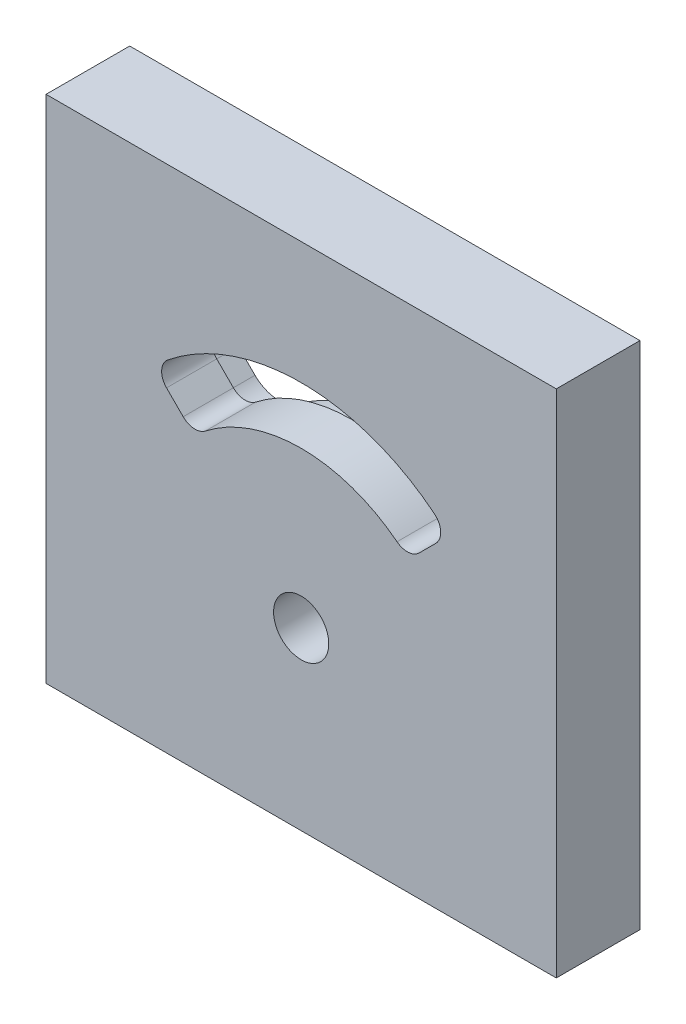
ISO-10303-21;
HEADER;
FILE_DESCRIPTION(('STEP AP214'),'2;1');
FILE_NAME('part.step','',(''),(''),'','','');
FILE_SCHEMA(('AUTOMOTIVE_DESIGN { 1 0 10303 214 1 1 1 1 }'));
ENDSEC;
DATA;
#1=APPLICATION_CONTEXT('core data for automotive mechanical design processes');
#2=APPLICATION_PROTOCOL_DEFINITION('international standard','automotive_design',2000,#1);
#3=PRODUCT_CONTEXT('',#1,'mechanical');
#4=PRODUCT('Part','Part','',(#3));
#5=PRODUCT_RELATED_PRODUCT_CATEGORY('part','',(#4));
#6=PRODUCT_DEFINITION_FORMATION('','',#4);
#7=PRODUCT_DEFINITION_CONTEXT('part definition',#1,'design');
#8=PRODUCT_DEFINITION('design','',#6,#7);
#9=PRODUCT_DEFINITION_SHAPE('','',#8);
#10=(LENGTH_UNIT() NAMED_UNIT(*) SI_UNIT(.MILLI.,.METRE.));
#11=(NAMED_UNIT(*) PLANE_ANGLE_UNIT() SI_UNIT($,.RADIAN.));
#12=(NAMED_UNIT(*) SI_UNIT($,.STERADIAN.) SOLID_ANGLE_UNIT());
#13=UNCERTAINTY_MEASURE_WITH_UNIT(LENGTH_MEASURE(1.E-05),#10,'distance_accuracy_value','');
#14=(GEOMETRIC_REPRESENTATION_CONTEXT(3) GLOBAL_UNCERTAINTY_ASSIGNED_CONTEXT((#13)) GLOBAL_UNIT_ASSIGNED_CONTEXT((#10,
#11,#12)) REPRESENTATION_CONTEXT('',''));
#15=CARTESIAN_POINT('',(0.,0.,0.));
#16=DIRECTION('',(0.,0.,1.));
#17=DIRECTION('',(1.,0.,0.));
#18=AXIS2_PLACEMENT_3D('',#15,#16,#17);
#19=CARTESIAN_POINT('',(0.,-4.75,-5.));
#20=DIRECTION('',(0.,0.,1.));
#21=DIRECTION('',(1.,0.,0.));
#22=AXIS2_PLACEMENT_3D('',#19,#20,#21);
#23=CYLINDRICAL_SURFACE('',#22,12.7);
#24=DIRECTION('',(0.,0.,1.));
#25=VECTOR('',#24,1.);
#26=CARTESIAN_POINT('',(-7.9700377500765,5.13779541972605,-5.));
#27=LINE('',#26,#25);
#28=CARTESIAN_POINT('',(-7.97003775007651,5.13779541972605,0.));
#29=VERTEX_POINT('',#28);
#30=CARTESIAN_POINT('',(-7.97003775007651,5.13779541972605,-3.));
#31=VERTEX_POINT('',#30);
#32=EDGE_CURVE('E11',#29,#31,#27,.F.);
#33=ORIENTED_EDGE('',*,*,#32,.T.);
#34=CARTESIAN_POINT('',(0.,-4.75,-3.));
#35=DIRECTION('',(0.,0.,-1.));
#36=DIRECTION('',(-1.,0.,0.));
#37=AXIS2_PLACEMENT_3D('',#34,#35,#36);
#38=CIRCLE('',#37,12.7);
#39=CARTESIAN_POINT('',(7.9700377500765,5.13779541972605,-3.));
#40=VERTEX_POINT('',#39);
#41=EDGE_CURVE('E24',#31,#40,#38,.T.);
#42=ORIENTED_EDGE('',*,*,#41,.T.);
#43=DIRECTION('',(0.,0.,1.));
#44=VECTOR('',#43,1.);
#45=CARTESIAN_POINT('',(7.97003775007651,5.13779541972605,-5.));
#46=LINE('',#45,#44);
#47=CARTESIAN_POINT('',(7.9700377500765,5.13779541972605,0.));
#48=VERTEX_POINT('',#47);
#49=EDGE_CURVE('E434',#40,#48,#46,.T.);
#50=ORIENTED_EDGE('',*,*,#49,.T.);
#51=CARTESIAN_POINT('',(0.,-4.75,0.));
#52=DIRECTION('',(0.,0.,-1.));
#53=DIRECTION('',(-1.,0.,0.));
#54=AXIS2_PLACEMENT_3D('',#51,#52,#53);
#55=CIRCLE('',#54,12.7);
#56=EDGE_CURVE('E431',#29,#48,#55,.T.);
#57=ORIENTED_EDGE('',*,*,#56,.F.);
#58=EDGE_LOOP('',(#33,#42,#50,#57));
#59=FACE_BOUND('',#58,.T.);
#60=ADVANCED_FACE('F17',(#59),#23,.F.);
#61=CARTESIAN_POINT('',(-8.18900691705113,3.79154648341029,-5.));
#62=DIRECTION('',(-0.707106781186548,-0.707106781186547,0.));
#63=DIRECTION('',(0.707106781186547,-0.707106781186548,0.));
#64=AXIS2_PLACEMENT_3D('',#61,#62,#63);
#65=PLANE('',#64);
#66=DIRECTION('',(0.707106781186547,-0.707106781186548,0.));
#67=VECTOR('',#66,1.);
#68=CARTESIAN_POINT('',(-8.18900691705113,3.79154648341029,-3.));
#69=LINE('',#68,#67);
#70=CARTESIAN_POINT('',(-8.04958250369797,3.65212207005713,-3.));
#71=VERTEX_POINT('',#70);
#72=CARTESIAN_POINT('',(-7.05315936755762,2.65569893391677,-3.));
#73=VERTEX_POINT('',#72);
#74=EDGE_CURVE('E428',#71,#73,#69,.T.);
#75=ORIENTED_EDGE('',*,*,#74,.F.);
#76=DIRECTION('',(0.,0.,1.));
#77=VECTOR('',#76,1.);
#78=CARTESIAN_POINT('',(-8.04958250369797,3.65212207005713,-5.));
#79=LINE('',#78,#77);
#80=CARTESIAN_POINT('',(-8.04958250369797,3.65212207005713,0.));
#81=VERTEX_POINT('',#80);
#82=EDGE_CURVE('E426',#71,#81,#79,.T.);
#83=ORIENTED_EDGE('',*,*,#82,.T.);
#84=DIRECTION('',(0.707106781186547,-0.707106781186548,0.));
#85=VECTOR('',#84,1.);
#86=CARTESIAN_POINT('',(-8.18900691705113,3.79154648341029,0.));
#87=LINE('',#86,#85);
#88=CARTESIAN_POINT('',(-7.05315936755762,2.65569893391677,0.));
#89=VERTEX_POINT('',#88);
#90=EDGE_CURVE('E424',#81,#89,#87,.T.);
#91=ORIENTED_EDGE('',*,*,#90,.T.);
#92=DIRECTION('',(0.,0.,-1.));
#93=VECTOR('',#92,1.);
#94=CARTESIAN_POINT('',(-7.05315936755762,2.65569893391677,-5.));
#95=LINE('',#94,#93);
#96=EDGE_CURVE('E422',#89,#73,#95,.T.);
#97=ORIENTED_EDGE('',*,*,#96,.T.);
#98=EDGE_LOOP('',(#75,#83,#91,#97));
#99=FACE_BOUND('',#98,.T.);
#100=ADVANCED_FACE('F467',(#99),#65,.F.);
#101=CARTESIAN_POINT('',(0.,-4.75,-5.));
#102=DIRECTION('',(0.,0.,1.));
#103=DIRECTION('',(1.,0.,0.));
#104=AXIS2_PLACEMENT_3D('',#101,#102,#103);
#105=CYLINDRICAL_SURFACE('',#104,9.3);
#106=CARTESIAN_POINT('',(0.,-4.75,-3.));
#107=DIRECTION('',(0.,0.,-1.));
#108=DIRECTION('',(-1.,0.,0.));
#109=AXIS2_PLACEMENT_3D('',#106,#107,#108);
#110=CIRCLE('',#109,9.3);
#111=CARTESIAN_POINT('',(-5.72993097604378,2.57515467480203,-3.));
#112=VERTEX_POINT('',#111);
#113=CARTESIAN_POINT('',(5.72993097604378,2.57515467480203,-3.));
#114=VERTEX_POINT('',#113);
#115=EDGE_CURVE('E419',#112,#114,#110,.T.);
#116=ORIENTED_EDGE('',*,*,#115,.F.);
#117=DIRECTION('',(0.,0.,1.));
#118=VECTOR('',#117,1.);
#119=CARTESIAN_POINT('',(-5.72993097604378,2.57515467480203,-5.));
#120=LINE('',#119,#118);
#121=CARTESIAN_POINT('',(-5.72993097604378,2.57515467480203,0.));
#122=VERTEX_POINT('',#121);
#123=EDGE_CURVE('E417',#112,#122,#120,.T.);
#124=ORIENTED_EDGE('',*,*,#123,.T.);
#125=CARTESIAN_POINT('',(0.,-4.75,0.));
#126=DIRECTION('',(0.,0.,-1.));
#127=DIRECTION('',(-1.,0.,0.));
#128=AXIS2_PLACEMENT_3D('',#125,#126,#127);
#129=CIRCLE('',#128,9.3);
#130=CARTESIAN_POINT('',(5.72993097604378,2.57515467480203,0.));
#131=VERTEX_POINT('',#130);
#132=EDGE_CURVE('E415',#122,#131,#129,.T.);
#133=ORIENTED_EDGE('',*,*,#132,.T.);
#134=DIRECTION('',(0.,0.,1.));
#135=VECTOR('',#134,1.);
#136=CARTESIAN_POINT('',(5.72993097604378,2.57515467480203,-5.));
#137=LINE('',#136,#135);
#138=EDGE_CURVE('E413',#131,#114,#137,.F.);
#139=ORIENTED_EDGE('',*,*,#138,.T.);
#140=EDGE_LOOP('',(#116,#124,#133,#139));
#141=FACE_BOUND('',#140,.T.);
#142=ADVANCED_FACE('F460',(#141),#105,.T.);
#143=CARTESIAN_POINT('',(8.18900691705112,3.79154648341028,-5.));
#144=DIRECTION('',(-0.707106781186547,0.707106781186548,0.));
#145=DIRECTION('',(-0.707106781186548,-0.707106781186547,0.));
#146=AXIS2_PLACEMENT_3D('',#143,#144,#145);
#147=PLANE('',#146);
#148=DIRECTION('',(0.,0.,-1.));
#149=VECTOR('',#148,1.);
#150=CARTESIAN_POINT('',(8.04958250369798,3.65212207005714,-5.));
#151=LINE('',#150,#149);
#152=CARTESIAN_POINT('',(8.04958250369798,3.65212207005714,0.));
#153=VERTEX_POINT('',#152);
#154=CARTESIAN_POINT('',(8.04958250369798,3.65212207005714,-3.));
#155=VERTEX_POINT('',#154);
#156=EDGE_CURVE('E411',#153,#155,#151,.T.);
#157=ORIENTED_EDGE('',*,*,#156,.T.);
#158=DIRECTION('',(-0.707106781186548,-0.707106781186547,0.));
#159=VECTOR('',#158,1.);
#160=CARTESIAN_POINT('',(8.18900691705112,3.79154648341028,-3.));
#161=LINE('',#160,#159);
#162=CARTESIAN_POINT('',(7.05315936755761,2.65569893391677,-3.));
#163=VERTEX_POINT('',#162);
#164=EDGE_CURVE('E409',#155,#163,#161,.T.);
#165=ORIENTED_EDGE('',*,*,#164,.T.);
#166=DIRECTION('',(0.,0.,1.));
#167=VECTOR('',#166,1.);
#168=CARTESIAN_POINT('',(7.05315936755761,2.65569893391677,-5.));
#169=LINE('',#168,#167);
#170=CARTESIAN_POINT('',(7.05315936755761,2.65569893391677,0.));
#171=VERTEX_POINT('',#170);
#172=EDGE_CURVE('E407',#163,#171,#169,.T.);
#173=ORIENTED_EDGE('',*,*,#172,.T.);
#174=DIRECTION('',(-0.707106781186548,-0.707106781186547,0.));
#175=VECTOR('',#174,1.);
#176=CARTESIAN_POINT('',(8.18900691705112,3.79154648341028,0.));
#177=LINE('',#176,#175);
#178=EDGE_CURVE('E404',#153,#171,#177,.T.);
#179=ORIENTED_EDGE('',*,*,#178,.F.);
#180=EDGE_LOOP('',(#157,#165,#173,#179));
#181=FACE_BOUND('',#180,.T.);
#182=ADVANCED_FACE('F452',(#181),#147,.T.);
#183=CARTESIAN_POINT('',(0.,-1.09875,-5.));
#184=DIRECTION('',(0.,0.,-1.));
#185=DIRECTION('',(1.,0.,0.));
#186=AXIS2_PLACEMENT_3D('',#183,#184,#185);
#187=PLANE('',#186);
#188=CARTESIAN_POINT('',(0.,-4.75,-5.));
#189=DIRECTION('',(0.,0.,-1.));
#190=DIRECTION('',(-1.,0.,0.));
#191=AXIS2_PLACEMENT_3D('',#188,#189,#190);
#192=CIRCLE('',#191,1.65);
#193=CARTESIAN_POINT('',(-1.65,-4.75,-5.));
#194=VERTEX_POINT('',#193);
#195=EDGE_CURVE('E399',#194,#194,#192,.T.);
#196=ORIENTED_EDGE('',*,*,#195,.F.);
#197=EDGE_LOOP('',(#196));
#198=FACE_BOUND('',#197,.T.);
#199=DIRECTION('',(0.,1.,0.));
#200=VECTOR('',#199,1.);
#201=CARTESIAN_POINT('',(15.25,-15.25,-5.));
#202=LINE('',#201,#200);
#203=CARTESIAN_POINT('',(15.25,-15.25,-5.));
#204=VERTEX_POINT('',#203);
#205=CARTESIAN_POINT('',(15.25,15.25,-5.));
#206=VERTEX_POINT('',#205);
#207=EDGE_CURVE('E395',#204,#206,#202,.T.);
#208=ORIENTED_EDGE('',*,*,#207,.F.);
#209=DIRECTION('',(1.,0.,0.));
#210=VECTOR('',#209,1.);
#211=CARTESIAN_POINT('',(-15.25,-15.25,-5.));
#212=LINE('',#211,#210);
#213=CARTESIAN_POINT('',(-15.25,-15.25,-5.));
#214=VERTEX_POINT('',#213);
#215=EDGE_CURVE('E391',#214,#204,#212,.T.);
#216=ORIENTED_EDGE('',*,*,#215,.F.);
#217=DIRECTION('',(0.,-1.,0.));
#218=VECTOR('',#217,1.);
#219=CARTESIAN_POINT('',(-15.25,15.25,-5.));
#220=LINE('',#219,#218);
#221=CARTESIAN_POINT('',(-15.25,15.25,-5.));
#222=VERTEX_POINT('',#221);
#223=EDGE_CURVE('E387',#222,#214,#220,.T.);
#224=ORIENTED_EDGE('',*,*,#223,.F.);
#225=DIRECTION('',(-1.,0.,0.));
#226=VECTOR('',#225,1.);
#227=CARTESIAN_POINT('',(15.25,15.25,-5.));
#228=LINE('',#227,#226);
#229=EDGE_CURVE('E385',#206,#222,#228,.T.);
#230=ORIENTED_EDGE('',*,*,#229,.F.);
#231=EDGE_LOOP('',(#208,#216,#224,#230));
#232=FACE_BOUND('',#231,.T.);
#233=CARTESIAN_POINT('',(0.,-4.75,-5.));
#234=DIRECTION('',(0.,0.,-1.));
#235=DIRECTION('',(-1.,0.,0.));
#236=AXIS2_PLACEMENT_3D('',#233,#234,#235);
#237=CIRCLE('',#236,8.3);
#238=CARTESIAN_POINT('',(-5.11380936571649,1.78750363450073,-5.));
#239=VERTEX_POINT('',#238);
#240=CARTESIAN_POINT('',(5.11380936571649,1.78750363450073,-5.));
#241=VERTEX_POINT('',#240);
#242=EDGE_CURVE('E383',#239,#241,#237,.T.);
#243=ORIENTED_EDGE('',*,*,#242,.T.);
#244=CARTESIAN_POINT('',(6.34605258637106,3.36280571510332,-5.));
#245=DIRECTION('',(0.,0.,1.));
#246=DIRECTION('',(-1.,0.,0.));
#247=AXIS2_PLACEMENT_3D('',#244,#245,#246);
#248=CIRCLE('',#247,2.);
#249=CARTESIAN_POINT('',(7.76026614874416,1.94859215273023,-5.));
#250=VERTEX_POINT('',#249);
#251=EDGE_CURVE('E381',#241,#250,#248,.T.);
#252=ORIENTED_EDGE('',*,*,#251,.T.);
#253=DIRECTION('',(-0.707106781186548,-0.707106781186548,0.));
#254=VECTOR('',#253,1.);
#255=CARTESIAN_POINT('',(8.25847771681434,2.44680372080041,-5.));
#256=LINE('',#255,#254);
#257=CARTESIAN_POINT('',(8.75668928488452,2.94501528887059,-5.));
#258=VERTEX_POINT('',#257);
#259=EDGE_CURVE('E379',#258,#250,#256,.T.);
#260=ORIENTED_EDGE('',*,*,#259,.F.);
#261=CARTESIAN_POINT('',(7.34247572251143,4.35922885124369,-5.));
#262=DIRECTION('',(0.,0.,1.));
#263=DIRECTION('',(-1.,0.,0.));
#264=AXIS2_PLACEMENT_3D('',#261,#262,#263);
#265=CIRCLE('',#264,2.);
#266=CARTESIAN_POINT('',(8.59759977764159,5.91636198820842,-5.));
#267=VERTEX_POINT('',#266);
#268=EDGE_CURVE('E157',#258,#267,#265,.T.);
#269=ORIENTED_EDGE('',*,*,#268,.T.);
#270=CARTESIAN_POINT('',(0.,-4.75,-5.));
#271=DIRECTION('',(0.,0.,-1.));
#272=DIRECTION('',(-1.,0.,0.));
#273=AXIS2_PLACEMENT_3D('',#270,#271,#272);
#274=CIRCLE('',#273,13.7);
#275=CARTESIAN_POINT('',(-8.59759977764158,5.91636198820842,-5.));
#276=VERTEX_POINT('',#275);
#277=EDGE_CURVE('E375',#276,#267,#274,.T.);
#278=ORIENTED_EDGE('',*,*,#277,.F.);
#279=CARTESIAN_POINT('',(-7.34247572251143,4.35922885124368,-5.));
#280=DIRECTION('',(0.,0.,1.));
#281=DIRECTION('',(-1.,0.,0.));
#282=AXIS2_PLACEMENT_3D('',#279,#280,#281);
#283=CIRCLE('',#282,2.);
#284=CARTESIAN_POINT('',(-8.75668928488452,2.94501528887058,-5.));
#285=VERTEX_POINT('',#284);
#286=EDGE_CURVE('E373',#276,#285,#283,.T.);
#287=ORIENTED_EDGE('',*,*,#286,.T.);
#288=DIRECTION('',(0.707106781186547,-0.707106781186548,0.));
#289=VECTOR('',#288,1.);
#290=CARTESIAN_POINT('',(-8.25847771681434,2.44680372080041,-5.));
#291=LINE('',#290,#289);
#292=CARTESIAN_POINT('',(-7.76026614874417,1.94859215273023,-5.));
#293=VERTEX_POINT('',#292);
#294=EDGE_CURVE('E371',#285,#293,#291,.T.);
#295=ORIENTED_EDGE('',*,*,#294,.T.);
#296=CARTESIAN_POINT('',(-6.34605258637107,3.36280571510332,-5.));
#297=DIRECTION('',(0.,0.,1.));
#298=DIRECTION('',(-1.,0.,0.));
#299=AXIS2_PLACEMENT_3D('',#296,#297,#298);
#300=CIRCLE('',#299,2.);
#301=EDGE_CURVE('E369',#293,#239,#300,.T.);
#302=ORIENTED_EDGE('',*,*,#301,.T.);
#303=EDGE_LOOP('',(#243,#252,#260,#269,#278,#287,#295,#302));
#304=FACE_BOUND('',#303,.T.);
#305=ADVANCED_FACE('F479',(#198,#232,#304),#187,.T.);
#306=CARTESIAN_POINT('',(-7.34247572251142,4.35922885124368,-5.));
#307=DIRECTION('',(0.,0.,1.));
#308=DIRECTION('',(1.,0.,0.));
#309=AXIS2_PLACEMENT_3D('',#306,#307,#308);
#310=CYLINDRICAL_SURFACE('',#309,1.);
#311=CARTESIAN_POINT('',(-7.34247572251142,4.35922885124368,-3.));
#312=DIRECTION('',(0.,0.,-1.));
#313=DIRECTION('',(-1.,0.,0.));
#314=AXIS2_PLACEMENT_3D('',#311,#312,#313);
#315=CIRCLE('',#314,1.);
#316=EDGE_CURVE('E366',#31,#71,#315,.F.);
#317=ORIENTED_EDGE('',*,*,#316,.F.);
#318=ORIENTED_EDGE('',*,*,#32,.F.);
#319=CARTESIAN_POINT('',(-7.34247572251142,4.35922885124368,0.));
#320=DIRECTION('',(0.,0.,-1.));
#321=DIRECTION('',(-1.,0.,0.));
#322=AXIS2_PLACEMENT_3D('',#319,#320,#321);
#323=CIRCLE('',#322,1.);
#324=EDGE_CURVE('E363',#81,#29,#323,.T.);
#325=ORIENTED_EDGE('',*,*,#324,.F.);
#326=ORIENTED_EDGE('',*,*,#82,.F.);
#327=EDGE_LOOP('',(#317,#318,#325,#326));
#328=FACE_BOUND('',#327,.T.);
#329=ADVANCED_FACE('F447',(#328),#310,.F.);
#330=CARTESIAN_POINT('',(7.34247572251143,4.35922885124368,-5.));
#331=DIRECTION('',(0.,0.,1.));
#332=DIRECTION('',(1.,0.,0.));
#333=AXIS2_PLACEMENT_3D('',#330,#331,#332);
#334=CYLINDRICAL_SURFACE('',#333,1.);
#335=CARTESIAN_POINT('',(7.34247572251143,4.35922885124368,-3.));
#336=DIRECTION('',(0.,0.,-1.));
#337=DIRECTION('',(-1.,0.,0.));
#338=AXIS2_PLACEMENT_3D('',#335,#336,#337);
#339=CIRCLE('',#338,1.);
#340=EDGE_CURVE('E360',#155,#40,#339,.F.);
#341=ORIENTED_EDGE('',*,*,#340,.F.);
#342=ORIENTED_EDGE('',*,*,#156,.F.);
#343=CARTESIAN_POINT('',(7.34247572251143,4.35922885124368,0.));
#344=DIRECTION('',(0.,0.,-1.));
#345=DIRECTION('',(-1.,0.,0.));
#346=AXIS2_PLACEMENT_3D('',#343,#344,#345);
#347=CIRCLE('',#346,1.);
#348=EDGE_CURVE('E357',#48,#153,#347,.T.);
#349=ORIENTED_EDGE('',*,*,#348,.F.);
#350=ORIENTED_EDGE('',*,*,#49,.F.);
#351=EDGE_LOOP('',(#341,#342,#349,#350));
#352=FACE_BOUND('',#351,.T.);
#353=ADVANCED_FACE('F439',(#352),#334,.F.);
#354=CARTESIAN_POINT('',(6.34605258637106,3.36280571510332,-5.));
#355=DIRECTION('',(0.,0.,1.));
#356=DIRECTION('',(1.,0.,0.));
#357=AXIS2_PLACEMENT_3D('',#354,#355,#356);
#358=CYLINDRICAL_SURFACE('',#357,1.);
#359=CARTESIAN_POINT('',(6.34605258637106,3.36280571510332,-3.));
#360=DIRECTION('',(0.,0.,-1.));
#361=DIRECTION('',(-1.,0.,0.));
#362=AXIS2_PLACEMENT_3D('',#359,#360,#361);
#363=CIRCLE('',#362,1.);
#364=EDGE_CURVE('E354',#114,#163,#363,.F.);
#365=ORIENTED_EDGE('',*,*,#364,.F.);
#366=ORIENTED_EDGE('',*,*,#138,.F.);
#367=CARTESIAN_POINT('',(6.34605258637106,3.36280571510332,0.));
#368=DIRECTION('',(0.,0.,-1.));
#369=DIRECTION('',(-1.,0.,0.));
#370=AXIS2_PLACEMENT_3D('',#367,#368,#369);
#371=CIRCLE('',#370,1.);
#372=EDGE_CURVE('E351',#171,#131,#371,.T.);
#373=ORIENTED_EDGE('',*,*,#372,.F.);
#374=ORIENTED_EDGE('',*,*,#172,.F.);
#375=EDGE_LOOP('',(#365,#366,#373,#374));
#376=FACE_BOUND('',#375,.T.);
#377=ADVANCED_FACE('F455',(#376),#358,.F.);
#378=CARTESIAN_POINT('',(-6.34605258637107,3.36280571510332,-5.));
#379=DIRECTION('',(0.,0.,1.));
#380=DIRECTION('',(1.,0.,0.));
#381=AXIS2_PLACEMENT_3D('',#378,#379,#380);
#382=CYLINDRICAL_SURFACE('',#381,1.);
#383=CARTESIAN_POINT('',(-6.34605258637107,3.36280571510332,-3.));
#384=DIRECTION('',(0.,0.,-1.));
#385=DIRECTION('',(-1.,0.,0.));
#386=AXIS2_PLACEMENT_3D('',#383,#384,#385);
#387=CIRCLE('',#386,1.);
#388=EDGE_CURVE('E348',#73,#112,#387,.F.);
#389=ORIENTED_EDGE('',*,*,#388,.F.);
#390=ORIENTED_EDGE('',*,*,#96,.F.);
#391=CARTESIAN_POINT('',(-6.34605258637107,3.36280571510332,0.));
#392=DIRECTION('',(0.,0.,-1.));
#393=DIRECTION('',(-1.,0.,0.));
#394=AXIS2_PLACEMENT_3D('',#391,#392,#393);
#395=CIRCLE('',#394,1.);
#396=EDGE_CURVE('E343',#122,#89,#395,.T.);
#397=ORIENTED_EDGE('',*,*,#396,.F.);
#398=ORIENTED_EDGE('',*,*,#123,.F.);
#399=EDGE_LOOP('',(#389,#390,#397,#398));
#400=FACE_BOUND('',#399,.T.);
#401=ADVANCED_FACE('F465',(#400),#382,.F.);
#402=CARTESIAN_POINT('',(15.25,-15.25,-5.));
#403=DIRECTION('',(1.,0.,0.));
#404=DIRECTION('',(0.,1.,0.));
#405=AXIS2_PLACEMENT_3D('',#402,#403,#404);
#406=PLANE('',#405);
#407=DIRECTION('',(0.,1.,0.));
#408=VECTOR('',#407,1.);
#409=CARTESIAN_POINT('',(15.25,-15.25,0.));
#410=LINE('',#409,#408);
#411=CARTESIAN_POINT('',(15.25,-15.25,0.));
#412=VERTEX_POINT('',#411);
#413=CARTESIAN_POINT('',(15.25,15.25,0.));
#414=VERTEX_POINT('',#413);
#415=EDGE_CURVE('E340',#412,#414,#410,.T.);
#416=ORIENTED_EDGE('',*,*,#415,.F.);
#417=CARTESIAN_POINT('',(15.25,-15.25,-5.));
#418=DIRECTION('',(0.,0.,1.));
#419=VECTOR('',#418,1.);
#420=LINE('',#417,#419);
#421=EDGE_CURVE('E339',#204,#412,#420,.T.);
#422=ORIENTED_EDGE('',*,*,#421,.F.);
#423=ORIENTED_EDGE('',*,*,#207,.T.);
#424=CARTESIAN_POINT('',(15.25,15.25,-5.));
#425=DIRECTION('',(0.,0.,1.));
#426=VECTOR('',#425,1.);
#427=LINE('',#424,#426);
#428=EDGE_CURVE('E249',#206,#414,#427,.T.);
#429=ORIENTED_EDGE('',*,*,#428,.T.);
#430=EDGE_LOOP('',(#416,#422,#423,#429));
#431=FACE_BOUND('',#430,.T.);
#432=ADVANCED_FACE('F298',(#431),#406,.T.);
#433=CARTESIAN_POINT('',(-15.25,-15.25,-5.));
#434=DIRECTION('',(0.,-1.,0.));
#435=DIRECTION('',(1.,0.,0.));
#436=AXIS2_PLACEMENT_3D('',#433,#434,#435);
#437=PLANE('',#436);
#438=DIRECTION('',(1.,0.,0.));
#439=VECTOR('',#438,1.);
#440=CARTESIAN_POINT('',(-15.25,-15.25,0.));
#441=LINE('',#440,#439);
#442=CARTESIAN_POINT('',(-15.25,-15.25,0.));
#443=VERTEX_POINT('',#442);
#444=EDGE_CURVE('E313',#443,#412,#441,.T.);
#445=ORIENTED_EDGE('',*,*,#444,.F.);
#446=CARTESIAN_POINT('',(-15.25,-15.25,-5.));
#447=DIRECTION('',(0.,0.,1.));
#448=VECTOR('',#447,1.);
#449=LINE('',#446,#448);
#450=EDGE_CURVE('E268',#214,#443,#449,.T.);
#451=ORIENTED_EDGE('',*,*,#450,.F.);
#452=ORIENTED_EDGE('',*,*,#215,.T.);
#453=ORIENTED_EDGE('',*,*,#421,.T.);
#454=EDGE_LOOP('',(#445,#451,#452,#453));
#455=FACE_BOUND('',#454,.T.);
#456=ADVANCED_FACE('F289',(#455),#437,.T.);
#457=CARTESIAN_POINT('',(-15.25,15.25,-5.));
#458=DIRECTION('',(-1.,0.,0.));
#459=DIRECTION('',(0.,-1.,0.));
#460=AXIS2_PLACEMENT_3D('',#457,#458,#459);
#461=PLANE('',#460);
#462=DIRECTION('',(0.,-1.,0.));
#463=VECTOR('',#462,1.);
#464=CARTESIAN_POINT('',(-15.25,15.25,0.));
#465=LINE('',#464,#463);
#466=CARTESIAN_POINT('',(-15.25,15.25,0.));
#467=VERTEX_POINT('',#466);
#468=EDGE_CURVE('E280',#467,#443,#465,.T.);
#469=ORIENTED_EDGE('',*,*,#468,.F.);
#470=CARTESIAN_POINT('',(-15.25,15.25,-5.));
#471=DIRECTION('',(0.,0.,1.));
#472=VECTOR('',#471,1.);
#473=LINE('',#470,#472);
#474=EDGE_CURVE('E252',#222,#467,#473,.T.);
#475=ORIENTED_EDGE('',*,*,#474,.F.);
#476=ORIENTED_EDGE('',*,*,#223,.T.);
#477=ORIENTED_EDGE('',*,*,#450,.T.);
#478=EDGE_LOOP('',(#469,#475,#476,#477));
#479=FACE_BOUND('',#478,.T.);
#480=ADVANCED_FACE('F231',(#479),#461,.T.);
#481=CARTESIAN_POINT('',(15.25,15.25,-5.));
#482=DIRECTION('',(0.,1.,0.));
#483=DIRECTION('',(-1.,0.,0.));
#484=AXIS2_PLACEMENT_3D('',#481,#482,#483);
#485=PLANE('',#484);
#486=DIRECTION('',(-1.,0.,0.));
#487=VECTOR('',#486,1.);
#488=CARTESIAN_POINT('',(15.25,15.25,0.));
#489=LINE('',#488,#487);
#490=EDGE_CURVE('E213',#414,#467,#489,.T.);
#491=ORIENTED_EDGE('',*,*,#490,.F.);
#492=ORIENTED_EDGE('',*,*,#428,.F.);
#493=ORIENTED_EDGE('',*,*,#229,.T.);
#494=ORIENTED_EDGE('',*,*,#474,.T.);
#495=EDGE_LOOP('',(#491,#492,#493,#494));
#496=FACE_BOUND('',#495,.T.);
#497=ADVANCED_FACE('F220',(#496),#485,.T.);
#498=CARTESIAN_POINT('',(0.,-4.75,-5.));
#499=DIRECTION('',(0.,0.,1.));
#500=DIRECTION('',(1.,0.,0.));
#501=AXIS2_PLACEMENT_3D('',#498,#499,#500);
#502=CYLINDRICAL_SURFACE('',#501,1.65);
#503=ORIENTED_EDGE('',*,*,#195,.T.);
#504=EDGE_LOOP('',(#503));
#505=FACE_BOUND('',#504,.T.);
#506=CARTESIAN_POINT('',(0.,-4.75,0.));
#507=DIRECTION('',(0.,0.,-1.));
#508=DIRECTION('',(-1.,0.,0.));
#509=AXIS2_PLACEMENT_3D('',#506,#507,#508);
#510=CIRCLE('',#509,1.65);
#511=CARTESIAN_POINT('',(-1.65,-4.75,0.));
#512=VERTEX_POINT('',#511);
#513=EDGE_CURVE('E210',#512,#512,#510,.T.);
#514=ORIENTED_EDGE('',*,*,#513,.F.);
#515=EDGE_LOOP('',(#514));
#516=FACE_BOUND('',#515,.T.);
#517=ADVANCED_FACE('F230',(#505,#516),#502,.F.);
#518=CARTESIAN_POINT('',(0.,-1.09875,0.));
#519=DIRECTION('',(0.,0.,-1.));
#520=DIRECTION('',(1.,0.,0.));
#521=AXIS2_PLACEMENT_3D('',#518,#519,#520);
#522=PLANE('',#521);
#523=ORIENTED_EDGE('',*,*,#90,.F.);
#524=ORIENTED_EDGE('',*,*,#324,.T.);
#525=ORIENTED_EDGE('',*,*,#56,.T.);
#526=ORIENTED_EDGE('',*,*,#348,.T.);
#527=ORIENTED_EDGE('',*,*,#178,.T.);
#528=ORIENTED_EDGE('',*,*,#372,.T.);
#529=ORIENTED_EDGE('',*,*,#132,.F.);
#530=ORIENTED_EDGE('',*,*,#396,.T.);
#531=EDGE_LOOP('',(#523,#524,#525,#526,#527,#528,#529,#530));
#532=FACE_BOUND('',#531,.T.);
#533=ORIENTED_EDGE('',*,*,#415,.T.);
#534=ORIENTED_EDGE('',*,*,#490,.T.);
#535=ORIENTED_EDGE('',*,*,#468,.T.);
#536=ORIENTED_EDGE('',*,*,#444,.T.);
#537=EDGE_LOOP('',(#533,#534,#535,#536));
#538=FACE_BOUND('',#537,.T.);
#539=ORIENTED_EDGE('',*,*,#513,.T.);
#540=EDGE_LOOP('',(#539));
#541=FACE_BOUND('',#540,.T.);
#542=ADVANCED_FACE('F442',(#532,#538,#541),#522,.F.);
#543=CARTESIAN_POINT('',(6.34605258637106,3.36280571510332,-3.));
#544=DIRECTION('',(0.,0.,-1.));
#545=DIRECTION('',(-1.,0.,0.));
#546=AXIS2_PLACEMENT_3D('',#543,#544,#545);
#547=CYLINDRICAL_SURFACE('',#546,2.);
#548=ORIENTED_EDGE('',*,*,#251,.F.);
#549=DIRECTION('',(0.,0.,-1.));
#550=VECTOR('',#549,1.);
#551=CARTESIAN_POINT('',(5.11380936571649,1.78750363450073,-3.));
#552=LINE('',#551,#550);
#553=CARTESIAN_POINT('',(5.11380936571649,1.78750363450073,-3.));
#554=VERTEX_POINT('',#553);
#555=EDGE_CURVE('E207',#554,#241,#552,.T.);
#556=ORIENTED_EDGE('',*,*,#555,.F.);
#557=CARTESIAN_POINT('',(6.34605258637106,3.36280571510332,-3.));
#558=DIRECTION('',(0.,0.,1.));
#559=DIRECTION('',(-1.,0.,0.));
#560=AXIS2_PLACEMENT_3D('',#557,#558,#559);
#561=CIRCLE('',#560,2.);
#562=CARTESIAN_POINT('',(7.76026614874416,1.94859215273023,-3.));
#563=VERTEX_POINT('',#562);
#564=EDGE_CURVE('E205',#554,#563,#561,.T.);
#565=ORIENTED_EDGE('',*,*,#564,.T.);
#566=DIRECTION('',(0.,0.,-1.));
#567=VECTOR('',#566,1.);
#568=CARTESIAN_POINT('',(7.76026614874416,1.94859215273023,-3.));
#569=LINE('',#568,#567);
#570=EDGE_CURVE('E167',#563,#250,#569,.T.);
#571=ORIENTED_EDGE('',*,*,#570,.T.);
#572=EDGE_LOOP('',(#548,#556,#565,#571));
#573=FACE_BOUND('',#572,.T.);
#574=ADVANCED_FACE('F502',(#573),#547,.F.);
#575=CARTESIAN_POINT('',(0.,-4.75,-3.));
#576=DIRECTION('',(0.,0.,-1.));
#577=DIRECTION('',(-1.,0.,0.));
#578=AXIS2_PLACEMENT_3D('',#575,#576,#577);
#579=CYLINDRICAL_SURFACE('',#578,8.3);
#580=ORIENTED_EDGE('',*,*,#242,.F.);
#581=DIRECTION('',(0.,0.,-1.));
#582=VECTOR('',#581,1.);
#583=CARTESIAN_POINT('',(-5.11380936571649,1.78750363450073,-3.));
#584=LINE('',#583,#582);
#585=CARTESIAN_POINT('',(-5.11380936571649,1.78750363450073,-3.));
#586=VERTEX_POINT('',#585);
#587=EDGE_CURVE('E201',#586,#239,#584,.T.);
#588=ORIENTED_EDGE('',*,*,#587,.F.);
#589=CARTESIAN_POINT('',(0.,-4.75,-3.));
#590=DIRECTION('',(0.,0.,-1.));
#591=DIRECTION('',(-1.,0.,0.));
#592=AXIS2_PLACEMENT_3D('',#589,#590,#591);
#593=CIRCLE('',#592,8.3);
#594=EDGE_CURVE('E198',#586,#554,#593,.T.);
#595=ORIENTED_EDGE('',*,*,#594,.T.);
#596=ORIENTED_EDGE('',*,*,#555,.T.);
#597=EDGE_LOOP('',(#580,#588,#595,#596));
#598=FACE_BOUND('',#597,.T.);
#599=ADVANCED_FACE('F503',(#598),#579,.T.);
#600=CARTESIAN_POINT('',(-6.34605258637107,3.36280571510332,-3.));
#601=DIRECTION('',(0.,0.,-1.));
#602=DIRECTION('',(-1.,0.,0.));
#603=AXIS2_PLACEMENT_3D('',#600,#601,#602);
#604=CYLINDRICAL_SURFACE('',#603,2.);
#605=ORIENTED_EDGE('',*,*,#301,.F.);
#606=DIRECTION('',(0.,0.,-1.));
#607=VECTOR('',#606,1.);
#608=CARTESIAN_POINT('',(-7.76026614874417,1.94859215273023,-3.));
#609=LINE('',#608,#607);
#610=CARTESIAN_POINT('',(-7.76026614874417,1.94859215273023,-3.));
#611=VERTEX_POINT('',#610);
#612=EDGE_CURVE('E195',#611,#293,#609,.T.);
#613=ORIENTED_EDGE('',*,*,#612,.F.);
#614=CARTESIAN_POINT('',(-6.34605258637107,3.36280571510332,-3.));
#615=DIRECTION('',(0.,0.,1.));
#616=DIRECTION('',(-1.,0.,0.));
#617=AXIS2_PLACEMENT_3D('',#614,#615,#616);
#618=CIRCLE('',#617,2.);
#619=EDGE_CURVE('E192',#611,#586,#618,.T.);
#620=ORIENTED_EDGE('',*,*,#619,.T.);
#621=ORIENTED_EDGE('',*,*,#587,.T.);
#622=EDGE_LOOP('',(#605,#613,#620,#621));
#623=FACE_BOUND('',#622,.T.);
#624=ADVANCED_FACE('F508',(#623),#604,.F.);
#625=CARTESIAN_POINT('',(-8.25847771681434,2.44680372080041,-3.));
#626=DIRECTION('',(0.707106781186548,0.707106781186547,0.));
#627=DIRECTION('',(-0.707106781186547,0.707106781186548,0.));
#628=AXIS2_PLACEMENT_3D('',#625,#626,#627);
#629=PLANE('',#628);
#630=ORIENTED_EDGE('',*,*,#294,.F.);
#631=DIRECTION('',(0.,0.,-1.));
#632=VECTOR('',#631,1.);
#633=CARTESIAN_POINT('',(-8.75668928488452,2.94501528887058,-3.));
#634=LINE('',#633,#632);
#635=CARTESIAN_POINT('',(-8.75668928488452,2.94501528887058,-3.));
#636=VERTEX_POINT('',#635);
#637=EDGE_CURVE('E189',#636,#285,#634,.T.);
#638=ORIENTED_EDGE('',*,*,#637,.F.);
#639=DIRECTION('',(0.707106781186547,-0.707106781186548,0.));
#640=VECTOR('',#639,1.);
#641=CARTESIAN_POINT('',(-8.25847771681434,2.44680372080041,-3.));
#642=LINE('',#641,#640);
#643=EDGE_CURVE('E186',#636,#611,#642,.T.);
#644=ORIENTED_EDGE('',*,*,#643,.T.);
#645=ORIENTED_EDGE('',*,*,#612,.T.);
#646=EDGE_LOOP('',(#630,#638,#644,#645));
#647=FACE_BOUND('',#646,.T.);
#648=ADVANCED_FACE('F511',(#647),#629,.T.);
#649=CARTESIAN_POINT('',(-7.34247572251143,4.35922885124368,-3.));
#650=DIRECTION('',(0.,0.,-1.));
#651=DIRECTION('',(-1.,0.,0.));
#652=AXIS2_PLACEMENT_3D('',#649,#650,#651);
#653=CYLINDRICAL_SURFACE('',#652,2.);
#654=ORIENTED_EDGE('',*,*,#286,.F.);
#655=DIRECTION('',(0.,0.,-1.));
#656=VECTOR('',#655,1.);
#657=CARTESIAN_POINT('',(-8.59759977764158,5.91636198820842,-3.));
#658=LINE('',#657,#656);
#659=CARTESIAN_POINT('',(-8.59759977764158,5.91636198820842,-3.));
#660=VERTEX_POINT('',#659);
#661=EDGE_CURVE('E183',#660,#276,#658,.T.);
#662=ORIENTED_EDGE('',*,*,#661,.F.);
#663=CARTESIAN_POINT('',(-7.34247572251143,4.35922885124368,-3.));
#664=DIRECTION('',(0.,0.,1.));
#665=DIRECTION('',(-1.,0.,0.));
#666=AXIS2_PLACEMENT_3D('',#663,#664,#665);
#667=CIRCLE('',#666,2.);
#668=EDGE_CURVE('E180',#660,#636,#667,.T.);
#669=ORIENTED_EDGE('',*,*,#668,.T.);
#670=ORIENTED_EDGE('',*,*,#637,.T.);
#671=EDGE_LOOP('',(#654,#662,#669,#670));
#672=FACE_BOUND('',#671,.T.);
#673=ADVANCED_FACE('F514',(#672),#653,.F.);
#674=CARTESIAN_POINT('',(0.,-4.75,-3.));
#675=DIRECTION('',(0.,0.,-1.));
#676=DIRECTION('',(-1.,0.,0.));
#677=AXIS2_PLACEMENT_3D('',#674,#675,#676);
#678=CYLINDRICAL_SURFACE('',#677,13.7);
#679=ORIENTED_EDGE('',*,*,#277,.T.);
#680=DIRECTION('',(0.,0.,-1.));
#681=VECTOR('',#680,1.);
#682=CARTESIAN_POINT('',(8.59759977764159,5.91636198820842,-3.));
#683=LINE('',#682,#681);
#684=CARTESIAN_POINT('',(8.59759977764159,5.91636198820842,-3.));
#685=VERTEX_POINT('',#684);
#686=EDGE_CURVE('E178',#685,#267,#683,.T.);
#687=ORIENTED_EDGE('',*,*,#686,.F.);
#688=CARTESIAN_POINT('',(0.,-4.75,-3.));
#689=DIRECTION('',(0.,0.,-1.));
#690=DIRECTION('',(-1.,0.,0.));
#691=AXIS2_PLACEMENT_3D('',#688,#689,#690);
#692=CIRCLE('',#691,13.7);
#693=EDGE_CURVE('E160',#660,#685,#692,.T.);
#694=ORIENTED_EDGE('',*,*,#693,.F.);
#695=ORIENTED_EDGE('',*,*,#661,.T.);
#696=EDGE_LOOP('',(#679,#687,#694,#695));
#697=FACE_BOUND('',#696,.T.);
#698=ADVANCED_FACE('F516',(#697),#678,.F.);
#699=CARTESIAN_POINT('',(7.34247572251143,4.35922885124369,-3.));
#700=DIRECTION('',(0.,0.,-1.));
#701=DIRECTION('',(-1.,0.,0.));
#702=AXIS2_PLACEMENT_3D('',#699,#700,#701);
#703=CYLINDRICAL_SURFACE('',#702,2.);
#704=ORIENTED_EDGE('',*,*,#268,.F.);
#705=DIRECTION('',(0.,0.,-1.));
#706=VECTOR('',#705,1.);
#707=CARTESIAN_POINT('',(8.75668928488452,2.94501528887059,-3.));
#708=LINE('',#707,#706);
#709=CARTESIAN_POINT('',(8.75668928488452,2.94501528887059,-3.));
#710=VERTEX_POINT('',#709);
#711=EDGE_CURVE('E150',#710,#258,#708,.T.);
#712=ORIENTED_EDGE('',*,*,#711,.F.);
#713=CARTESIAN_POINT('',(7.34247572251143,4.35922885124369,-3.));
#714=DIRECTION('',(0.,0.,1.));
#715=DIRECTION('',(-1.,0.,0.));
#716=AXIS2_PLACEMENT_3D('',#713,#714,#715);
#717=CIRCLE('',#716,2.);
#718=EDGE_CURVE('E155',#710,#685,#717,.T.);
#719=ORIENTED_EDGE('',*,*,#718,.T.);
#720=ORIENTED_EDGE('',*,*,#686,.T.);
#721=EDGE_LOOP('',(#704,#712,#719,#720));
#722=FACE_BOUND('',#721,.T.);
#723=ADVANCED_FACE('F152',(#722),#703,.F.);
#724=CARTESIAN_POINT('',(8.25847771681434,2.44680372080041,-3.));
#725=DIRECTION('',(0.707106781186548,-0.707106781186548,0.));
#726=DIRECTION('',(0.707106781186548,0.707106781186548,0.));
#727=AXIS2_PLACEMENT_3D('',#724,#725,#726);
#728=PLANE('',#727);
#729=ORIENTED_EDGE('',*,*,#259,.T.);
#730=ORIENTED_EDGE('',*,*,#570,.F.);
#731=DIRECTION('',(-0.707106781186548,-0.707106781186548,0.));
#732=VECTOR('',#731,1.);
#733=CARTESIAN_POINT('',(8.25847771681434,2.44680372080041,-3.));
#734=LINE('',#733,#732);
#735=EDGE_CURVE('E164',#710,#563,#734,.T.);
#736=ORIENTED_EDGE('',*,*,#735,.F.);
#737=ORIENTED_EDGE('',*,*,#711,.T.);
#738=EDGE_LOOP('',(#729,#730,#736,#737));
#739=FACE_BOUND('',#738,.T.);
#740=ADVANCED_FACE('F165',(#739),#728,.F.);
#741=CARTESIAN_POINT('',(0.,0.,-3.));
#742=DIRECTION('',(0.,0.,-1.));
#743=DIRECTION('',(1.,0.,0.));
#744=AXIS2_PLACEMENT_3D('',#741,#742,#743);
#745=PLANE('',#744);
#746=ORIENTED_EDGE('',*,*,#564,.F.);
#747=ORIENTED_EDGE('',*,*,#594,.F.);
#748=ORIENTED_EDGE('',*,*,#619,.F.);
#749=ORIENTED_EDGE('',*,*,#643,.F.);
#750=ORIENTED_EDGE('',*,*,#668,.F.);
#751=ORIENTED_EDGE('',*,*,#693,.T.);
#752=ORIENTED_EDGE('',*,*,#718,.F.);
#753=ORIENTED_EDGE('',*,*,#735,.T.);
#754=EDGE_LOOP('',(#746,#747,#748,#749,#750,#751,#752,#753));
#755=FACE_BOUND('',#754,.T.);
#756=ORIENTED_EDGE('',*,*,#41,.F.);
#757=ORIENTED_EDGE('',*,*,#316,.T.);
#758=ORIENTED_EDGE('',*,*,#74,.T.);
#759=ORIENTED_EDGE('',*,*,#388,.T.);
#760=ORIENTED_EDGE('',*,*,#115,.T.);
#761=ORIENTED_EDGE('',*,*,#364,.T.);
#762=ORIENTED_EDGE('',*,*,#164,.F.);
#763=ORIENTED_EDGE('',*,*,#340,.T.);
#764=EDGE_LOOP('',(#756,#757,#758,#759,#760,#761,#762,#763));
#765=FACE_BOUND('',#764,.T.);
#766=ADVANCED_FACE('F171',(#755,#765),#745,.T.);
#767=CLOSED_SHELL('',(#60,#100,#142,#182,#305,#329,#353,#377,#401,#432,#456,#480,#497,#517,#542,
#574,#599,#624,#648,#673,#698,#723,#740,#766));
#768=MANIFOLD_SOLID_BREP('B1',#767);
#769=ADVANCED_BREP_SHAPE_REPRESENTATION('',(#18,#768),#14);
#770=SHAPE_DEFINITION_REPRESENTATION(#9,#769);
ENDSEC;
END-ISO-10303-21;
